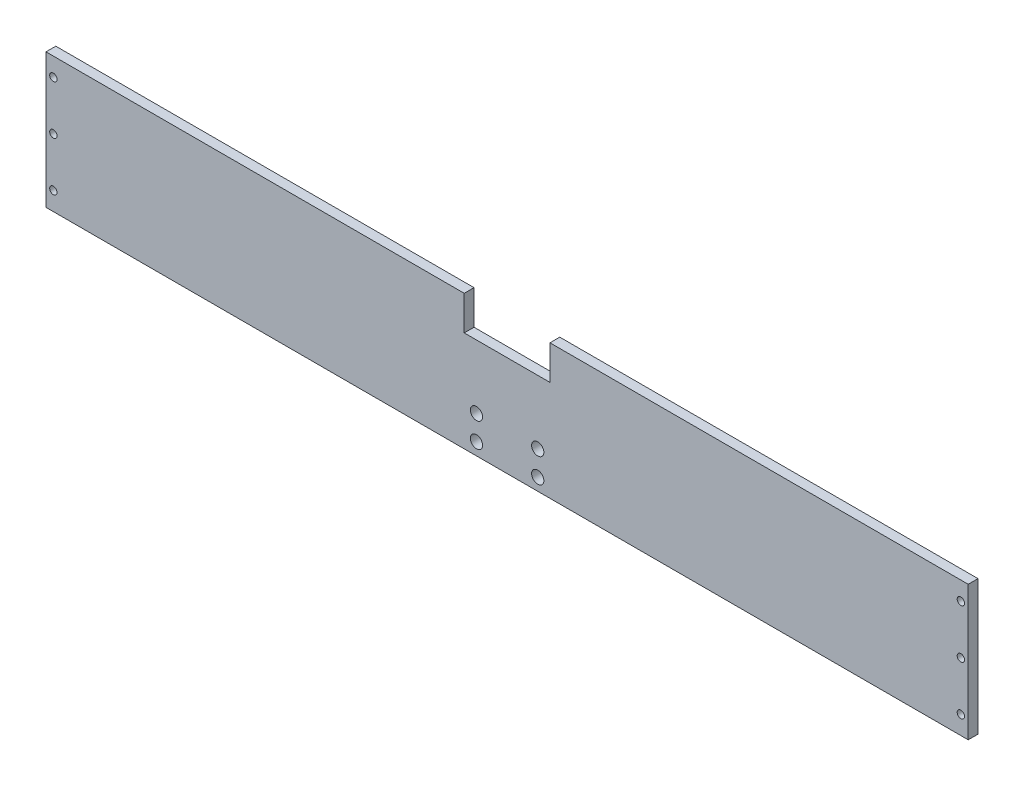
ISO-10303-21;
HEADER;
FILE_DESCRIPTION(('STEP AP214'),'2;1');
FILE_NAME('part.step','',(''),(''),'','','');
FILE_SCHEMA(('AUTOMOTIVE_DESIGN { 1 0 10303 214 1 1 1 1 }'));
ENDSEC;
DATA;
#1=APPLICATION_CONTEXT('core data for automotive mechanical design processes');
#2=APPLICATION_PROTOCOL_DEFINITION('international standard','automotive_design',2000,#1);
#3=PRODUCT_CONTEXT('',#1,'mechanical');
#4=PRODUCT('Part','Part','',(#3));
#5=PRODUCT_RELATED_PRODUCT_CATEGORY('part','',(#4));
#6=PRODUCT_DEFINITION_FORMATION('','',#4);
#7=PRODUCT_DEFINITION_CONTEXT('part definition',#1,'design');
#8=PRODUCT_DEFINITION('design','',#6,#7);
#9=PRODUCT_DEFINITION_SHAPE('','',#8);
#10=(LENGTH_UNIT() NAMED_UNIT(*) SI_UNIT(.MILLI.,.METRE.));
#11=(NAMED_UNIT(*) PLANE_ANGLE_UNIT() SI_UNIT($,.RADIAN.));
#12=(NAMED_UNIT(*) SI_UNIT($,.STERADIAN.) SOLID_ANGLE_UNIT());
#13=UNCERTAINTY_MEASURE_WITH_UNIT(LENGTH_MEASURE(1.E-05),#10,'distance_accuracy_value','');
#14=(GEOMETRIC_REPRESENTATION_CONTEXT(3) GLOBAL_UNCERTAINTY_ASSIGNED_CONTEXT((#13)) GLOBAL_UNIT_ASSIGNED_CONTEXT((#10,
#11,#12)) REPRESENTATION_CONTEXT('',''));
#15=CARTESIAN_POINT('',(0.,0.,0.));
#16=DIRECTION('',(0.,0.,1.));
#17=DIRECTION('',(1.,0.,0.));
#18=AXIS2_PLACEMENT_3D('',#15,#16,#17);
#19=CARTESIAN_POINT('',(0.,110.,8.));
#20=DIRECTION('',(0.,-1.,0.));
#21=DIRECTION('',(0.,0.,-1.));
#22=AXIS2_PLACEMENT_3D('',#19,#20,#21);
#23=PLANE('',#22);
#24=DIRECTION('',(-1.,0.,0.));
#25=VECTOR('',#24,1.);
#26=CARTESIAN_POINT('',(0.,110.,0.));
#27=LINE('',#26,#25);
#28=CARTESIAN_POINT('',(752.95,110.,0.));
#29=VERTEX_POINT('',#28);
#30=CARTESIAN_POINT('',(411.475,110.,0.));
#31=VERTEX_POINT('',#30);
#32=EDGE_CURVE('E126',#29,#31,#27,.T.);
#33=ORIENTED_EDGE('',*,*,#32,.T.);
#34=DIRECTION('',(0.,0.,1.));
#35=VECTOR('',#34,1.);
#36=CARTESIAN_POINT('',(411.475,110.,-0.000999999999999265));
#37=LINE('',#36,#35);
#38=CARTESIAN_POINT('',(411.475,110.,8.));
#39=VERTEX_POINT('',#38);
#40=EDGE_CURVE('E106',#31,#39,#37,.T.);
#41=ORIENTED_EDGE('',*,*,#40,.T.);
#42=DIRECTION('',(-1.,0.,0.));
#43=VECTOR('',#42,1.);
#44=CARTESIAN_POINT('',(0.,110.,8.));
#45=LINE('',#44,#43);
#46=CARTESIAN_POINT('',(752.95,110.,8.));
#47=VERTEX_POINT('',#46);
#48=EDGE_CURVE('E142',#47,#39,#45,.T.);
#49=ORIENTED_EDGE('',*,*,#48,.F.);
#50=DIRECTION('',(0.,0.,-1.));
#51=VECTOR('',#50,1.);
#52=CARTESIAN_POINT('',(752.95,110.,8.));
#53=LINE('',#52,#51);
#54=EDGE_CURVE('E132',#47,#29,#53,.T.);
#55=ORIENTED_EDGE('',*,*,#54,.T.);
#56=EDGE_LOOP('',(#33,#41,#49,#55));
#57=FACE_BOUND('',#56,.T.);
#58=ADVANCED_FACE('F32',(#57),#23,.F.);
#59=CARTESIAN_POINT('',(0.,0.,8.));
#60=DIRECTION('',(1.,0.,0.));
#61=DIRECTION('',(0.,0.,-1.));
#62=AXIS2_PLACEMENT_3D('',#59,#60,#61);
#63=PLANE('',#62);
#64=DIRECTION('',(0.,-1.,0.));
#65=VECTOR('',#64,1.);
#66=CARTESIAN_POINT('',(0.,0.,0.));
#67=LINE('',#66,#65);
#68=CARTESIAN_POINT('',(0.,110.,0.));
#69=VERTEX_POINT('',#68);
#70=CARTESIAN_POINT('',(0.,0.,0.));
#71=VERTEX_POINT('',#70);
#72=EDGE_CURVE('E150',#69,#71,#67,.T.);
#73=ORIENTED_EDGE('',*,*,#72,.T.);
#74=DIRECTION('',(0.,0.,-1.));
#75=VECTOR('',#74,1.);
#76=CARTESIAN_POINT('',(0.,0.,8.));
#77=LINE('',#76,#75);
#78=CARTESIAN_POINT('',(0.,0.,8.));
#79=VERTEX_POINT('',#78);
#80=EDGE_CURVE('E11',#79,#71,#77,.T.);
#81=ORIENTED_EDGE('',*,*,#80,.F.);
#82=DIRECTION('',(0.,-1.,0.));
#83=VECTOR('',#82,1.);
#84=CARTESIAN_POINT('',(0.,0.,8.));
#85=LINE('',#84,#83);
#86=CARTESIAN_POINT('',(0.,110.,8.));
#87=VERTEX_POINT('',#86);
#88=EDGE_CURVE('E133',#87,#79,#85,.T.);
#89=ORIENTED_EDGE('',*,*,#88,.F.);
#90=DIRECTION('',(0.,0.,-1.));
#91=VECTOR('',#90,1.);
#92=CARTESIAN_POINT('',(0.,110.,8.));
#93=LINE('',#92,#91);
#94=EDGE_CURVE('E140',#87,#69,#93,.T.);
#95=ORIENTED_EDGE('',*,*,#94,.T.);
#96=EDGE_LOOP('',(#73,#81,#89,#95));
#97=FACE_BOUND('',#96,.T.);
#98=ADVANCED_FACE('F34',(#97),#63,.F.);
#99=CARTESIAN_POINT('',(0.,0.,8.));
#100=DIRECTION('',(0.,1.,0.));
#101=DIRECTION('',(0.,0.,1.));
#102=AXIS2_PLACEMENT_3D('',#99,#100,#101);
#103=PLANE('',#102);
#104=DIRECTION('',(1.,0.,0.));
#105=VECTOR('',#104,1.);
#106=CARTESIAN_POINT('',(0.,0.,0.));
#107=LINE('',#106,#105);
#108=CARTESIAN_POINT('',(752.95,0.,0.));
#109=VERTEX_POINT('',#108);
#110=EDGE_CURVE('E149',#71,#109,#107,.T.);
#111=ORIENTED_EDGE('',*,*,#110,.T.);
#112=DIRECTION('',(0.,0.,-1.));
#113=VECTOR('',#112,1.);
#114=CARTESIAN_POINT('',(752.95,0.,8.));
#115=LINE('',#114,#113);
#116=CARTESIAN_POINT('',(752.95,0.,8.));
#117=VERTEX_POINT('',#116);
#118=EDGE_CURVE('E40',#117,#109,#115,.T.);
#119=ORIENTED_EDGE('',*,*,#118,.F.);
#120=DIRECTION('',(1.,0.,0.));
#121=VECTOR('',#120,1.);
#122=CARTESIAN_POINT('',(0.,0.,8.));
#123=LINE('',#122,#121);
#124=EDGE_CURVE('E85',#79,#117,#123,.T.);
#125=ORIENTED_EDGE('',*,*,#124,.F.);
#126=ORIENTED_EDGE('',*,*,#80,.T.);
#127=EDGE_LOOP('',(#111,#119,#125,#126));
#128=FACE_BOUND('',#127,.T.);
#129=ADVANCED_FACE('F251',(#128),#103,.F.);
#130=CARTESIAN_POINT('',(752.95,0.,8.));
#131=DIRECTION('',(-1.,0.,0.));
#132=DIRECTION('',(0.,0.,1.));
#133=AXIS2_PLACEMENT_3D('',#130,#131,#132);
#134=PLANE('',#133);
#135=DIRECTION('',(0.,1.,0.));
#136=VECTOR('',#135,1.);
#137=CARTESIAN_POINT('',(752.95,0.,0.));
#138=LINE('',#137,#136);
#139=EDGE_CURVE('E136',#109,#29,#138,.T.);
#140=ORIENTED_EDGE('',*,*,#139,.T.);
#141=ORIENTED_EDGE('',*,*,#54,.F.);
#142=DIRECTION('',(0.,1.,0.));
#143=VECTOR('',#142,1.);
#144=CARTESIAN_POINT('',(752.95,0.,8.));
#145=LINE('',#144,#143);
#146=EDGE_CURVE('E147',#117,#47,#145,.T.);
#147=ORIENTED_EDGE('',*,*,#146,.F.);
#148=ORIENTED_EDGE('',*,*,#118,.T.);
#149=EDGE_LOOP('',(#140,#141,#147,#148));
#150=FACE_BOUND('',#149,.T.);
#151=ADVANCED_FACE('F146',(#150),#134,.F.);
#152=CARTESIAN_POINT('',(341.475,110.,8.));
#153=VERTEX_POINT('',#152);
#154=EDGE_CURVE('E56',#153,#87,#45,.T.);
#155=ORIENTED_EDGE('',*,*,#154,.F.);
#156=DIRECTION('',(0.,0.,1.));
#157=VECTOR('',#156,1.);
#158=CARTESIAN_POINT('',(341.475,110.,-0.000999999999999265));
#159=LINE('',#158,#157);
#160=CARTESIAN_POINT('',(341.475,110.,0.));
#161=VERTEX_POINT('',#160);
#162=EDGE_CURVE('E117',#161,#153,#159,.T.);
#163=ORIENTED_EDGE('',*,*,#162,.F.);
#164=EDGE_CURVE('E78',#161,#69,#27,.T.);
#165=ORIENTED_EDGE('',*,*,#164,.T.);
#166=ORIENTED_EDGE('',*,*,#94,.F.);
#167=EDGE_LOOP('',(#155,#163,#165,#166));
#168=FACE_BOUND('',#167,.T.);
#169=ADVANCED_FACE('F229',(#168),#23,.F.);
#170=CARTESIAN_POINT('',(0.,0.,8.));
#171=DIRECTION('',(0.,0.,-1.));
#172=DIRECTION('',(-1.,0.,0.));
#173=AXIS2_PLACEMENT_3D('',#170,#171,#172);
#174=PLANE('',#173);
#175=CARTESIAN_POINT('',(746.95,95.0000000000001,8.));
#176=DIRECTION('',(0.,0.,1.));
#177=DIRECTION('',(-1.,0.,0.));
#178=AXIS2_PLACEMENT_3D('',#175,#176,#177);
#179=CIRCLE('',#178,3.00000000000005);
#180=CARTESIAN_POINT('',(743.95,95.0000000000001,8.));
#181=VERTEX_POINT('',#180);
#182=EDGE_CURVE('E209',#181,#181,#179,.T.);
#183=ORIENTED_EDGE('',*,*,#182,.F.);
#184=EDGE_LOOP('',(#183));
#185=FACE_BOUND('',#184,.T.);
#186=CARTESIAN_POINT('',(746.95,55.0000000000001,8.));
#187=DIRECTION('',(0.,0.,1.));
#188=DIRECTION('',(-1.,0.,0.));
#189=AXIS2_PLACEMENT_3D('',#186,#187,#188);
#190=CIRCLE('',#189,3.00000000000005);
#191=CARTESIAN_POINT('',(743.95,55.0000000000001,8.));
#192=VERTEX_POINT('',#191);
#193=EDGE_CURVE('E203',#192,#192,#190,.T.);
#194=ORIENTED_EDGE('',*,*,#193,.F.);
#195=EDGE_LOOP('',(#194));
#196=FACE_BOUND('',#195,.T.);
#197=CARTESIAN_POINT('',(746.95,15.0000000000001,8.));
#198=DIRECTION('',(0.,0.,1.));
#199=DIRECTION('',(-1.,0.,0.));
#200=AXIS2_PLACEMENT_3D('',#197,#198,#199);
#201=CIRCLE('',#200,3.00000000000005);
#202=CARTESIAN_POINT('',(743.95,15.0000000000001,8.));
#203=VERTEX_POINT('',#202);
#204=EDGE_CURVE('E197',#203,#203,#201,.T.);
#205=ORIENTED_EDGE('',*,*,#204,.F.);
#206=EDGE_LOOP('',(#205));
#207=FACE_BOUND('',#206,.T.);
#208=CARTESIAN_POINT('',(6.,15.,8.));
#209=DIRECTION('',(0.,0.,1.));
#210=DIRECTION('',(1.,0.,0.));
#211=AXIS2_PLACEMENT_3D('',#208,#209,#210);
#212=CIRCLE('',#211,3.);
#213=CARTESIAN_POINT('',(9.,15.,8.));
#214=VERTEX_POINT('',#213);
#215=EDGE_CURVE('E191',#214,#214,#212,.T.);
#216=ORIENTED_EDGE('',*,*,#215,.F.);
#217=EDGE_LOOP('',(#216));
#218=FACE_BOUND('',#217,.T.);
#219=CARTESIAN_POINT('',(6.,55.,8.));
#220=DIRECTION('',(0.,0.,1.));
#221=DIRECTION('',(1.,0.,0.));
#222=AXIS2_PLACEMENT_3D('',#219,#220,#221);
#223=CIRCLE('',#222,3.);
#224=CARTESIAN_POINT('',(9.,55.,8.));
#225=VERTEX_POINT('',#224);
#226=EDGE_CURVE('E185',#225,#225,#223,.T.);
#227=ORIENTED_EDGE('',*,*,#226,.F.);
#228=EDGE_LOOP('',(#227));
#229=FACE_BOUND('',#228,.T.);
#230=CARTESIAN_POINT('',(6.,95.,8.));
#231=DIRECTION('',(0.,0.,1.));
#232=DIRECTION('',(1.,0.,0.));
#233=AXIS2_PLACEMENT_3D('',#230,#231,#232);
#234=CIRCLE('',#233,3.);
#235=CARTESIAN_POINT('',(9.,95.,8.));
#236=VERTEX_POINT('',#235);
#237=EDGE_CURVE('E179',#236,#236,#234,.T.);
#238=ORIENTED_EDGE('',*,*,#237,.F.);
#239=EDGE_LOOP('',(#238));
#240=FACE_BOUND('',#239,.T.);
#241=CARTESIAN_POINT('',(401.475,10.,8.));
#242=DIRECTION('',(0.,0.,1.));
#243=DIRECTION('',(-1.,0.,0.));
#244=AXIS2_PLACEMENT_3D('',#241,#242,#243);
#245=CIRCLE('',#244,4.99999999999999);
#246=CARTESIAN_POINT('',(396.475,10.,8.));
#247=VERTEX_POINT('',#246);
#248=EDGE_CURVE('E173',#247,#247,#245,.T.);
#249=ORIENTED_EDGE('',*,*,#248,.F.);
#250=EDGE_LOOP('',(#249));
#251=FACE_BOUND('',#250,.T.);
#252=CARTESIAN_POINT('',(401.475,30.,8.));
#253=DIRECTION('',(0.,0.,1.));
#254=DIRECTION('',(-1.,0.,0.));
#255=AXIS2_PLACEMENT_3D('',#252,#253,#254);
#256=CIRCLE('',#255,4.99999999999999);
#257=CARTESIAN_POINT('',(396.475,30.,8.));
#258=VERTEX_POINT('',#257);
#259=EDGE_CURVE('E167',#258,#258,#256,.T.);
#260=ORIENTED_EDGE('',*,*,#259,.F.);
#261=EDGE_LOOP('',(#260));
#262=FACE_BOUND('',#261,.T.);
#263=CARTESIAN_POINT('',(351.475,10.,8.));
#264=DIRECTION('',(0.,0.,1.));
#265=DIRECTION('',(1.,0.,0.));
#266=AXIS2_PLACEMENT_3D('',#263,#264,#265);
#267=CIRCLE('',#266,4.99999999999999);
#268=CARTESIAN_POINT('',(356.475,10.,8.));
#269=VERTEX_POINT('',#268);
#270=EDGE_CURVE('E161',#269,#269,#267,.T.);
#271=ORIENTED_EDGE('',*,*,#270,.F.);
#272=EDGE_LOOP('',(#271));
#273=FACE_BOUND('',#272,.T.);
#274=CARTESIAN_POINT('',(351.475,30.,8.));
#275=DIRECTION('',(0.,0.,1.));
#276=DIRECTION('',(1.,0.,0.));
#277=AXIS2_PLACEMENT_3D('',#274,#275,#276);
#278=CIRCLE('',#277,4.99999999999999);
#279=CARTESIAN_POINT('',(356.475,30.,8.));
#280=VERTEX_POINT('',#279);
#281=EDGE_CURVE('E152',#280,#280,#278,.T.);
#282=ORIENTED_EDGE('',*,*,#281,.F.);
#283=EDGE_LOOP('',(#282));
#284=FACE_BOUND('',#283,.T.);
#285=ORIENTED_EDGE('',*,*,#48,.T.);
#286=DIRECTION('',(0.,1.,0.));
#287=VECTOR('',#286,1.);
#288=CARTESIAN_POINT('',(411.475,82.,8.));
#289=LINE('',#288,#287);
#290=CARTESIAN_POINT('',(411.475,82.,8.));
#291=VERTEX_POINT('',#290);
#292=EDGE_CURVE('E112',#291,#39,#289,.T.);
#293=ORIENTED_EDGE('',*,*,#292,.F.);
#294=DIRECTION('',(1.,0.,0.));
#295=VECTOR('',#294,1.);
#296=CARTESIAN_POINT('',(341.475,82.,8.));
#297=LINE('',#296,#295);
#298=CARTESIAN_POINT('',(341.475,82.,8.));
#299=VERTEX_POINT('',#298);
#300=EDGE_CURVE('E118',#299,#291,#297,.T.);
#301=ORIENTED_EDGE('',*,*,#300,.F.);
#302=DIRECTION('',(0.,-1.,0.));
#303=VECTOR('',#302,1.);
#304=CARTESIAN_POINT('',(341.475,82.,8.));
#305=LINE('',#304,#303);
#306=EDGE_CURVE('E223',#153,#299,#305,.T.);
#307=ORIENTED_EDGE('',*,*,#306,.F.);
#308=ORIENTED_EDGE('',*,*,#154,.T.);
#309=ORIENTED_EDGE('',*,*,#88,.T.);
#310=ORIENTED_EDGE('',*,*,#124,.T.);
#311=ORIENTED_EDGE('',*,*,#146,.T.);
#312=EDGE_LOOP('',(#285,#293,#301,#307,#308,#309,#310,#311));
#313=FACE_BOUND('',#312,.T.);
#314=ADVANCED_FACE('F233',(#185,#196,#207,#218,#229,#240,#251,#262,#273,#284,#313),#174,.F.);
#315=CARTESIAN_POINT('',(0.,0.,0.));
#316=DIRECTION('',(0.,0.,-1.));
#317=DIRECTION('',(-1.,0.,0.));
#318=AXIS2_PLACEMENT_3D('',#315,#316,#317);
#319=PLANE('',#318);
#320=DIRECTION('',(0.,1.,0.));
#321=VECTOR('',#320,1.);
#322=CARTESIAN_POINT('',(411.475,82.,0.));
#323=LINE('',#322,#321);
#324=CARTESIAN_POINT('',(411.475,82.,0.));
#325=VERTEX_POINT('',#324);
#326=EDGE_CURVE('E109',#325,#31,#323,.T.);
#327=ORIENTED_EDGE('',*,*,#326,.T.);
#328=ORIENTED_EDGE('',*,*,#32,.F.);
#329=ORIENTED_EDGE('',*,*,#139,.F.);
#330=ORIENTED_EDGE('',*,*,#110,.F.);
#331=ORIENTED_EDGE('',*,*,#72,.F.);
#332=ORIENTED_EDGE('',*,*,#164,.F.);
#333=DIRECTION('',(0.,-1.,0.));
#334=VECTOR('',#333,1.);
#335=CARTESIAN_POINT('',(341.475,82.,0.));
#336=LINE('',#335,#334);
#337=CARTESIAN_POINT('',(341.475,82.,0.));
#338=VERTEX_POINT('',#337);
#339=EDGE_CURVE('E227',#161,#338,#336,.T.);
#340=ORIENTED_EDGE('',*,*,#339,.T.);
#341=DIRECTION('',(1.,0.,0.));
#342=VECTOR('',#341,1.);
#343=CARTESIAN_POINT('',(341.475,82.,0.));
#344=LINE('',#343,#342);
#345=EDGE_CURVE('E128',#338,#325,#344,.T.);
#346=ORIENTED_EDGE('',*,*,#345,.T.);
#347=EDGE_LOOP('',(#327,#328,#329,#330,#331,#332,#340,#346));
#348=FACE_BOUND('',#347,.T.);
#349=CARTESIAN_POINT('',(746.95,95.0000000000001,0.));
#350=DIRECTION('',(0.,0.,-1.));
#351=DIRECTION('',(-1.,0.,0.));
#352=AXIS2_PLACEMENT_3D('',#349,#350,#351);
#353=CIRCLE('',#352,3.00000000000005);
#354=CARTESIAN_POINT('',(743.95,95.0000000000001,0.));
#355=VERTEX_POINT('',#354);
#356=EDGE_CURVE('E212',#355,#355,#353,.F.);
#357=ORIENTED_EDGE('',*,*,#356,.T.);
#358=EDGE_LOOP('',(#357));
#359=FACE_BOUND('',#358,.T.);
#360=CARTESIAN_POINT('',(746.95,55.0000000000001,0.));
#361=DIRECTION('',(0.,0.,-1.));
#362=DIRECTION('',(-1.,0.,0.));
#363=AXIS2_PLACEMENT_3D('',#360,#361,#362);
#364=CIRCLE('',#363,3.00000000000005);
#365=CARTESIAN_POINT('',(743.95,55.0000000000001,0.));
#366=VERTEX_POINT('',#365);
#367=EDGE_CURVE('E206',#366,#366,#364,.F.);
#368=ORIENTED_EDGE('',*,*,#367,.T.);
#369=EDGE_LOOP('',(#368));
#370=FACE_BOUND('',#369,.T.);
#371=CARTESIAN_POINT('',(746.95,15.0000000000001,0.));
#372=DIRECTION('',(0.,0.,-1.));
#373=DIRECTION('',(-1.,0.,0.));
#374=AXIS2_PLACEMENT_3D('',#371,#372,#373);
#375=CIRCLE('',#374,3.00000000000005);
#376=CARTESIAN_POINT('',(743.95,15.0000000000001,0.));
#377=VERTEX_POINT('',#376);
#378=EDGE_CURVE('E200',#377,#377,#375,.F.);
#379=ORIENTED_EDGE('',*,*,#378,.T.);
#380=EDGE_LOOP('',(#379));
#381=FACE_BOUND('',#380,.T.);
#382=CARTESIAN_POINT('',(6.,15.,0.));
#383=DIRECTION('',(0.,0.,-1.));
#384=DIRECTION('',(-1.,0.,0.));
#385=AXIS2_PLACEMENT_3D('',#382,#383,#384);
#386=CIRCLE('',#385,3.);
#387=CARTESIAN_POINT('',(3.,15.,0.));
#388=VERTEX_POINT('',#387);
#389=EDGE_CURVE('E194',#388,#388,#386,.F.);
#390=ORIENTED_EDGE('',*,*,#389,.T.);
#391=EDGE_LOOP('',(#390));
#392=FACE_BOUND('',#391,.T.);
#393=CARTESIAN_POINT('',(6.,55.,0.));
#394=DIRECTION('',(0.,0.,-1.));
#395=DIRECTION('',(-1.,0.,0.));
#396=AXIS2_PLACEMENT_3D('',#393,#394,#395);
#397=CIRCLE('',#396,3.);
#398=CARTESIAN_POINT('',(3.,55.,0.));
#399=VERTEX_POINT('',#398);
#400=EDGE_CURVE('E188',#399,#399,#397,.F.);
#401=ORIENTED_EDGE('',*,*,#400,.T.);
#402=EDGE_LOOP('',(#401));
#403=FACE_BOUND('',#402,.T.);
#404=CARTESIAN_POINT('',(6.,95.,0.));
#405=DIRECTION('',(0.,0.,-1.));
#406=DIRECTION('',(-1.,0.,0.));
#407=AXIS2_PLACEMENT_3D('',#404,#405,#406);
#408=CIRCLE('',#407,3.);
#409=CARTESIAN_POINT('',(3.,95.,0.));
#410=VERTEX_POINT('',#409);
#411=EDGE_CURVE('E182',#410,#410,#408,.F.);
#412=ORIENTED_EDGE('',*,*,#411,.T.);
#413=EDGE_LOOP('',(#412));
#414=FACE_BOUND('',#413,.T.);
#415=CARTESIAN_POINT('',(401.475,10.,0.));
#416=DIRECTION('',(0.,0.,-1.));
#417=DIRECTION('',(-1.,0.,0.));
#418=AXIS2_PLACEMENT_3D('',#415,#416,#417);
#419=CIRCLE('',#418,4.99999999999999);
#420=CARTESIAN_POINT('',(396.475,10.,0.));
#421=VERTEX_POINT('',#420);
#422=EDGE_CURVE('E176',#421,#421,#419,.F.);
#423=ORIENTED_EDGE('',*,*,#422,.T.);
#424=EDGE_LOOP('',(#423));
#425=FACE_BOUND('',#424,.T.);
#426=CARTESIAN_POINT('',(401.475,30.,0.));
#427=DIRECTION('',(0.,0.,-1.));
#428=DIRECTION('',(-1.,0.,0.));
#429=AXIS2_PLACEMENT_3D('',#426,#427,#428);
#430=CIRCLE('',#429,4.99999999999999);
#431=CARTESIAN_POINT('',(396.475,30.,0.));
#432=VERTEX_POINT('',#431);
#433=EDGE_CURVE('E170',#432,#432,#430,.F.);
#434=ORIENTED_EDGE('',*,*,#433,.T.);
#435=EDGE_LOOP('',(#434));
#436=FACE_BOUND('',#435,.T.);
#437=CARTESIAN_POINT('',(351.475,10.,0.));
#438=DIRECTION('',(0.,0.,-1.));
#439=DIRECTION('',(-1.,0.,0.));
#440=AXIS2_PLACEMENT_3D('',#437,#438,#439);
#441=CIRCLE('',#440,4.99999999999999);
#442=CARTESIAN_POINT('',(346.475,10.,0.));
#443=VERTEX_POINT('',#442);
#444=EDGE_CURVE('E164',#443,#443,#441,.F.);
#445=ORIENTED_EDGE('',*,*,#444,.T.);
#446=EDGE_LOOP('',(#445));
#447=FACE_BOUND('',#446,.T.);
#448=CARTESIAN_POINT('',(351.475,30.,0.));
#449=DIRECTION('',(0.,0.,-1.));
#450=DIRECTION('',(-1.,0.,0.));
#451=AXIS2_PLACEMENT_3D('',#448,#449,#450);
#452=CIRCLE('',#451,4.99999999999999);
#453=CARTESIAN_POINT('',(346.475,30.,0.));
#454=VERTEX_POINT('',#453);
#455=EDGE_CURVE('E158',#454,#454,#452,.F.);
#456=ORIENTED_EDGE('',*,*,#455,.T.);
#457=EDGE_LOOP('',(#456));
#458=FACE_BOUND('',#457,.T.);
#459=ADVANCED_FACE('F123',(#348,#359,#370,#381,#392,#403,#414,#425,#436,#447,#458),#319,.T.);
#460=CARTESIAN_POINT('',(351.475,30.,-0.000999999999999265));
#461=DIRECTION('',(0.,0.,1.));
#462=DIRECTION('',(1.,0.,0.));
#463=AXIS2_PLACEMENT_3D('',#460,#461,#462);
#464=CYLINDRICAL_SURFACE('',#463,4.99999999999999);
#465=ORIENTED_EDGE('',*,*,#455,.F.);
#466=EDGE_LOOP('',(#465));
#467=FACE_BOUND('',#466,.T.);
#468=ORIENTED_EDGE('',*,*,#281,.T.);
#469=EDGE_LOOP('',(#468));
#470=FACE_BOUND('',#469,.T.);
#471=ADVANCED_FACE('F296',(#467,#470),#464,.F.);
#472=CARTESIAN_POINT('',(351.475,10.,-0.000999999999999265));
#473=DIRECTION('',(0.,0.,1.));
#474=DIRECTION('',(1.,0.,0.));
#475=AXIS2_PLACEMENT_3D('',#472,#473,#474);
#476=CYLINDRICAL_SURFACE('',#475,4.99999999999999);
#477=ORIENTED_EDGE('',*,*,#444,.F.);
#478=EDGE_LOOP('',(#477));
#479=FACE_BOUND('',#478,.T.);
#480=ORIENTED_EDGE('',*,*,#270,.T.);
#481=EDGE_LOOP('',(#480));
#482=FACE_BOUND('',#481,.T.);
#483=ADVANCED_FACE('F303',(#479,#482),#476,.F.);
#484=CARTESIAN_POINT('',(401.475,30.,-0.000999999999999265));
#485=DIRECTION('',(0.,0.,1.));
#486=DIRECTION('',(1.,0.,0.));
#487=AXIS2_PLACEMENT_3D('',#484,#485,#486);
#488=CYLINDRICAL_SURFACE('',#487,4.99999999999999);
#489=ORIENTED_EDGE('',*,*,#433,.F.);
#490=EDGE_LOOP('',(#489));
#491=FACE_BOUND('',#490,.T.);
#492=ORIENTED_EDGE('',*,*,#259,.T.);
#493=EDGE_LOOP('',(#492));
#494=FACE_BOUND('',#493,.T.);
#495=ADVANCED_FACE('F312',(#491,#494),#488,.F.);
#496=CARTESIAN_POINT('',(401.475,10.,-0.000999999999999265));
#497=DIRECTION('',(0.,0.,1.));
#498=DIRECTION('',(1.,0.,0.));
#499=AXIS2_PLACEMENT_3D('',#496,#497,#498);
#500=CYLINDRICAL_SURFACE('',#499,4.99999999999999);
#501=ORIENTED_EDGE('',*,*,#422,.F.);
#502=EDGE_LOOP('',(#501));
#503=FACE_BOUND('',#502,.T.);
#504=ORIENTED_EDGE('',*,*,#248,.T.);
#505=EDGE_LOOP('',(#504));
#506=FACE_BOUND('',#505,.T.);
#507=ADVANCED_FACE('F321',(#503,#506),#500,.F.);
#508=CARTESIAN_POINT('',(6.,95.,-0.000999999999999265));
#509=DIRECTION('',(0.,0.,1.));
#510=DIRECTION('',(1.,0.,0.));
#511=AXIS2_PLACEMENT_3D('',#508,#509,#510);
#512=CYLINDRICAL_SURFACE('',#511,3.);
#513=ORIENTED_EDGE('',*,*,#411,.F.);
#514=EDGE_LOOP('',(#513));
#515=FACE_BOUND('',#514,.T.);
#516=ORIENTED_EDGE('',*,*,#237,.T.);
#517=EDGE_LOOP('',(#516));
#518=FACE_BOUND('',#517,.T.);
#519=ADVANCED_FACE('F330',(#515,#518),#512,.F.);
#520=CARTESIAN_POINT('',(6.,55.,-0.000999999999999265));
#521=DIRECTION('',(0.,0.,1.));
#522=DIRECTION('',(1.,0.,0.));
#523=AXIS2_PLACEMENT_3D('',#520,#521,#522);
#524=CYLINDRICAL_SURFACE('',#523,3.);
#525=ORIENTED_EDGE('',*,*,#400,.F.);
#526=EDGE_LOOP('',(#525));
#527=FACE_BOUND('',#526,.T.);
#528=ORIENTED_EDGE('',*,*,#226,.T.);
#529=EDGE_LOOP('',(#528));
#530=FACE_BOUND('',#529,.T.);
#531=ADVANCED_FACE('F339',(#527,#530),#524,.F.);
#532=CARTESIAN_POINT('',(6.,15.,-0.000999999999999265));
#533=DIRECTION('',(0.,0.,1.));
#534=DIRECTION('',(1.,0.,0.));
#535=AXIS2_PLACEMENT_3D('',#532,#533,#534);
#536=CYLINDRICAL_SURFACE('',#535,3.);
#537=ORIENTED_EDGE('',*,*,#389,.F.);
#538=EDGE_LOOP('',(#537));
#539=FACE_BOUND('',#538,.T.);
#540=ORIENTED_EDGE('',*,*,#215,.T.);
#541=EDGE_LOOP('',(#540));
#542=FACE_BOUND('',#541,.T.);
#543=ADVANCED_FACE('F348',(#539,#542),#536,.F.);
#544=CARTESIAN_POINT('',(746.95,15.0000000000001,-0.000999999999999265));
#545=DIRECTION('',(0.,0.,1.));
#546=DIRECTION('',(1.,0.,0.));
#547=AXIS2_PLACEMENT_3D('',#544,#545,#546);
#548=CYLINDRICAL_SURFACE('',#547,3.00000000000005);
#549=ORIENTED_EDGE('',*,*,#378,.F.);
#550=EDGE_LOOP('',(#549));
#551=FACE_BOUND('',#550,.T.);
#552=ORIENTED_EDGE('',*,*,#204,.T.);
#553=EDGE_LOOP('',(#552));
#554=FACE_BOUND('',#553,.T.);
#555=ADVANCED_FACE('F357',(#551,#554),#548,.F.);
#556=CARTESIAN_POINT('',(746.95,55.0000000000001,-0.000999999999999265));
#557=DIRECTION('',(0.,0.,1.));
#558=DIRECTION('',(1.,0.,0.));
#559=AXIS2_PLACEMENT_3D('',#556,#557,#558);
#560=CYLINDRICAL_SURFACE('',#559,3.00000000000005);
#561=ORIENTED_EDGE('',*,*,#367,.F.);
#562=EDGE_LOOP('',(#561));
#563=FACE_BOUND('',#562,.T.);
#564=ORIENTED_EDGE('',*,*,#193,.T.);
#565=EDGE_LOOP('',(#564));
#566=FACE_BOUND('',#565,.T.);
#567=ADVANCED_FACE('F366',(#563,#566),#560,.F.);
#568=CARTESIAN_POINT('',(746.95,95.0000000000001,-0.000999999999999265));
#569=DIRECTION('',(0.,0.,1.));
#570=DIRECTION('',(1.,0.,0.));
#571=AXIS2_PLACEMENT_3D('',#568,#569,#570);
#572=CYLINDRICAL_SURFACE('',#571,3.00000000000005);
#573=ORIENTED_EDGE('',*,*,#356,.F.);
#574=EDGE_LOOP('',(#573));
#575=FACE_BOUND('',#574,.T.);
#576=ORIENTED_EDGE('',*,*,#182,.T.);
#577=EDGE_LOOP('',(#576));
#578=FACE_BOUND('',#577,.T.);
#579=ADVANCED_FACE('F244',(#575,#578),#572,.F.);
#580=CARTESIAN_POINT('',(411.475,82.,-0.000999999999999265));
#581=DIRECTION('',(1.,0.,0.));
#582=DIRECTION('',(0.,0.,-1.));
#583=AXIS2_PLACEMENT_3D('',#580,#581,#582);
#584=PLANE('',#583);
#585=DIRECTION('',(0.,0.,1.));
#586=VECTOR('',#585,1.);
#587=CARTESIAN_POINT('',(411.475,82.,-0.000999999999999265));
#588=LINE('',#587,#586);
#589=EDGE_CURVE('E215',#325,#291,#588,.T.);
#590=ORIENTED_EDGE('',*,*,#589,.T.);
#591=ORIENTED_EDGE('',*,*,#292,.T.);
#592=ORIENTED_EDGE('',*,*,#40,.F.);
#593=ORIENTED_EDGE('',*,*,#326,.F.);
#594=EDGE_LOOP('',(#590,#591,#592,#593));
#595=FACE_BOUND('',#594,.T.);
#596=ADVANCED_FACE('F108',(#595),#584,.F.);
#597=CARTESIAN_POINT('',(341.475,82.,-0.000999999999999265));
#598=DIRECTION('',(0.,-1.,0.));
#599=DIRECTION('',(0.,0.,-1.));
#600=AXIS2_PLACEMENT_3D('',#597,#598,#599);
#601=PLANE('',#600);
#602=DIRECTION('',(0.,0.,1.));
#603=VECTOR('',#602,1.);
#604=CARTESIAN_POINT('',(341.475,82.,-0.000999999999999265));
#605=LINE('',#604,#603);
#606=EDGE_CURVE('E47',#338,#299,#605,.T.);
#607=ORIENTED_EDGE('',*,*,#606,.T.);
#608=ORIENTED_EDGE('',*,*,#300,.T.);
#609=ORIENTED_EDGE('',*,*,#589,.F.);
#610=ORIENTED_EDGE('',*,*,#345,.F.);
#611=EDGE_LOOP('',(#607,#608,#609,#610));
#612=FACE_BOUND('',#611,.T.);
#613=ADVANCED_FACE('F236',(#612),#601,.F.);
#614=CARTESIAN_POINT('',(341.475,82.,-0.000999999999999265));
#615=DIRECTION('',(-1.,0.,0.));
#616=DIRECTION('',(0.,0.,1.));
#617=AXIS2_PLACEMENT_3D('',#614,#615,#616);
#618=PLANE('',#617);
#619=ORIENTED_EDGE('',*,*,#162,.T.);
#620=ORIENTED_EDGE('',*,*,#306,.T.);
#621=ORIENTED_EDGE('',*,*,#606,.F.);
#622=ORIENTED_EDGE('',*,*,#339,.F.);
#623=EDGE_LOOP('',(#619,#620,#621,#622));
#624=FACE_BOUND('',#623,.T.);
#625=ADVANCED_FACE('F228',(#624),#618,.F.);
#626=CLOSED_SHELL('',(#58,#98,#129,#151,#169,#314,#459,#471,#483,#495,#507,#519,#531,#543,#555,
#567,#579,#596,#613,#625));
#627=MANIFOLD_SOLID_BREP('B2',#626);
#628=ADVANCED_BREP_SHAPE_REPRESENTATION('',(#18,#627),#14);
#629=SHAPE_DEFINITION_REPRESENTATION(#9,#628);
ENDSEC;
END-ISO-10303-21;
